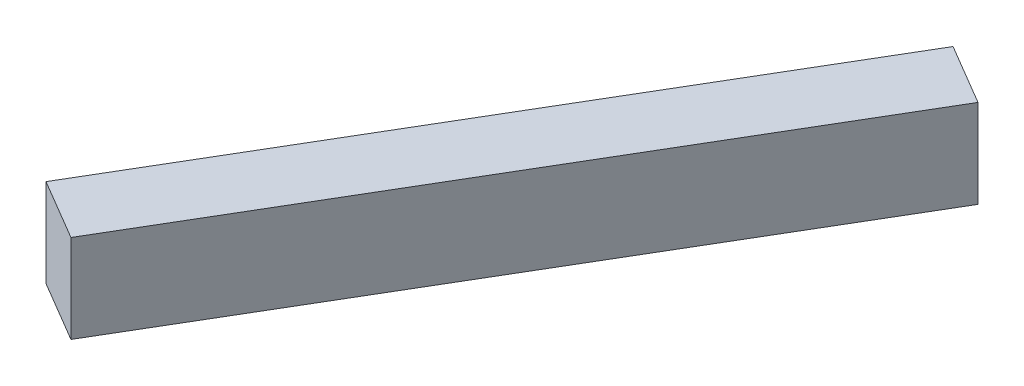
ISO-10303-21;
HEADER;
FILE_DESCRIPTION(('STEP AP214'),'2;1');
FILE_NAME('part.step','',(''),(''),'','','');
FILE_SCHEMA(('AUTOMOTIVE_DESIGN { 1 0 10303 214 1 1 1 1 }'));
ENDSEC;
DATA;
#1=APPLICATION_CONTEXT('core data for automotive mechanical design processes');
#2=APPLICATION_PROTOCOL_DEFINITION('international standard','automotive_design',2000,#1);
#3=PRODUCT_CONTEXT('',#1,'mechanical');
#4=PRODUCT('Part','Part','',(#3));
#5=PRODUCT_RELATED_PRODUCT_CATEGORY('part','',(#4));
#6=PRODUCT_DEFINITION_FORMATION('','',#4);
#7=PRODUCT_DEFINITION_CONTEXT('part definition',#1,'design');
#8=PRODUCT_DEFINITION('design','',#6,#7);
#9=PRODUCT_DEFINITION_SHAPE('','',#8);
#10=(LENGTH_UNIT() NAMED_UNIT(*) SI_UNIT(.MILLI.,.METRE.));
#11=(NAMED_UNIT(*) PLANE_ANGLE_UNIT() SI_UNIT($,.RADIAN.));
#12=(NAMED_UNIT(*) SI_UNIT($,.STERADIAN.) SOLID_ANGLE_UNIT());
#13=UNCERTAINTY_MEASURE_WITH_UNIT(LENGTH_MEASURE(1.E-05),#10,'distance_accuracy_value','');
#14=(GEOMETRIC_REPRESENTATION_CONTEXT(3) GLOBAL_UNCERTAINTY_ASSIGNED_CONTEXT((#13)) GLOBAL_UNIT_ASSIGNED_CONTEXT((#10,
#11,#12)) REPRESENTATION_CONTEXT('',''));
#15=CARTESIAN_POINT('',(0.,0.,0.));
#16=DIRECTION('',(0.,0.,1.));
#17=DIRECTION('',(1.,0.,0.));
#18=AXIS2_PLACEMENT_3D('',#15,#16,#17);
#19=CARTESIAN_POINT('',(9.05780376443169,7.874,-15.5523080797249));
#20=DIRECTION('',(0.861316006342608,0.,0.508069618475677));
#21=DIRECTION('',(0.508069618475677,0.,-0.861316006342608));
#22=AXIS2_PLACEMENT_3D('',#19,#20,#21);
#23=PLANE('',#22);
#24=DIRECTION('',(0.,1.,0.));
#25=VECTOR('',#24,1.);
#26=CARTESIAN_POINT('',(9.05780376443169,7.874,-15.5523080797249));
#27=LINE('',#26,#25);
#28=CARTESIAN_POINT('',(9.05780376443169,7.62,-15.5523080797249));
#29=VERTEX_POINT('',#28);
#30=CARTESIAN_POINT('',(9.05780376443169,7.874,-15.5523080797249));
#31=VERTEX_POINT('',#30);
#32=EDGE_CURVE('E20',#29,#31,#27,.T.);
#33=ORIENTED_EDGE('',*,*,#32,.T.);
#34=DIRECTION('',(0.508069618475711,0.,-0.861316006342588));
#35=VECTOR('',#34,1.);
#36=CARTESIAN_POINT('',(9.05780376443169,7.874,-15.5523080797249));
#37=LINE('',#36,#35);
#38=CARTESIAN_POINT('',(10.0256763876279,7.874,-17.1931150718075));
#39=VERTEX_POINT('',#38);
#40=EDGE_CURVE('E55',#31,#39,#37,.T.);
#41=ORIENTED_EDGE('',*,*,#40,.T.);
#42=DIRECTION('',(0.,1.,0.));
#43=VECTOR('',#42,1.);
#44=CARTESIAN_POINT('',(10.0256763876279,7.874,-17.1931150718075));
#45=LINE('',#44,#43);
#46=CARTESIAN_POINT('',(10.0256763876279,7.62,-17.1931150718075));
#47=VERTEX_POINT('',#46);
#48=EDGE_CURVE('E76',#39,#47,#45,.F.);
#49=ORIENTED_EDGE('',*,*,#48,.T.);
#50=DIRECTION('',(0.508069618475711,0.,-0.861316006342588));
#51=VECTOR('',#50,1.);
#52=CARTESIAN_POINT('',(9.05780376443169,7.62,-15.5523080797249));
#53=LINE('',#52,#51);
#54=EDGE_CURVE('E58',#29,#47,#53,.T.);
#55=ORIENTED_EDGE('',*,*,#54,.F.);
#56=EDGE_LOOP('',(#33,#41,#49,#55));
#57=FACE_BOUND('',#56,.T.);
#58=ADVANCED_FACE('F17',(#57),#23,.F.);
#59=CARTESIAN_POINT('',(9.05780376443169,7.874,-15.5523080797249));
#60=DIRECTION('',(0.508069618475639,0.,-0.861316006342631));
#61=DIRECTION('',(-0.861316006342631,0.,-0.508069618475639));
#62=AXIS2_PLACEMENT_3D('',#59,#60,#61);
#63=PLANE('',#62);
#64=DIRECTION('',(0.,1.,0.));
#65=VECTOR('',#64,1.);
#66=CARTESIAN_POINT('',(9.23282317692052,7.874,-15.4490683332506));
#67=LINE('',#66,#65);
#68=CARTESIAN_POINT('',(9.23282317692053,7.62,-15.4490683332506));
#69=VERTEX_POINT('',#68);
#70=CARTESIAN_POINT('',(9.23282317692053,7.874,-15.4490683332506));
#71=VERTEX_POINT('',#70);
#72=EDGE_CURVE('E73',#69,#71,#67,.T.);
#73=ORIENTED_EDGE('',*,*,#72,.T.);
#74=DIRECTION('',(-0.861316006342529,0.,-0.508069618475811));
#75=VECTOR('',#74,1.);
#76=CARTESIAN_POINT('',(9.23282317692052,7.874,-15.4490683332506));
#77=LINE('',#76,#75);
#78=EDGE_CURVE('E63',#71,#31,#77,.T.);
#79=ORIENTED_EDGE('',*,*,#78,.T.);
#80=ORIENTED_EDGE('',*,*,#32,.F.);
#81=DIRECTION('',(-0.861316006342529,0.,-0.508069618475811));
#82=VECTOR('',#81,1.);
#83=CARTESIAN_POINT('',(9.23282317692052,7.62,-15.4490683332506));
#84=LINE('',#83,#82);
#85=EDGE_CURVE('E80',#69,#29,#84,.T.);
#86=ORIENTED_EDGE('',*,*,#85,.F.);
#87=EDGE_LOOP('',(#73,#79,#80,#86));
#88=FACE_BOUND('',#87,.T.);
#89=ADVANCED_FACE('F72',(#88),#63,.F.);
#90=CARTESIAN_POINT('',(9.05780376443169,7.874,-15.5523080797249));
#91=DIRECTION('',(0.,-1.,0.));
#92=DIRECTION('',(0.,0.,-1.));
#93=AXIS2_PLACEMENT_3D('',#90,#91,#92);
#94=PLANE('',#93);
#95=ORIENTED_EDGE('',*,*,#78,.F.);
#96=DIRECTION('',(-0.508069618475676,0.,0.861316006342609));
#97=VECTOR('',#96,1.);
#98=CARTESIAN_POINT('',(9.23282317692052,7.874,-15.4490683332506));
#99=LINE('',#98,#97);
#100=CARTESIAN_POINT('',(10.2006958002738,7.874,-17.0898753255997));
#101=VERTEX_POINT('',#100);
#102=EDGE_CURVE('E83',#71,#101,#99,.F.);
#103=ORIENTED_EDGE('',*,*,#102,.T.);
#104=DIRECTION('',(0.861316007116063,0.,0.508069617164461));
#105=VECTOR('',#104,1.);
#106=CARTESIAN_POINT('',(10.0256763876279,7.874,-17.1931150718075));
#107=LINE('',#106,#105);
#108=EDGE_CURVE('E69',#101,#39,#107,.F.);
#109=ORIENTED_EDGE('',*,*,#108,.T.);
#110=ORIENTED_EDGE('',*,*,#40,.F.);
#111=EDGE_LOOP('',(#95,#103,#109,#110));
#112=FACE_BOUND('',#111,.T.);
#113=ADVANCED_FACE('F66',(#112),#94,.F.);
#114=CARTESIAN_POINT('',(10.0256763876279,7.874,-17.1931150718075));
#115=DIRECTION('',(-0.508069617164461,0.,0.861316007116063));
#116=DIRECTION('',(0.861316007116063,0.,0.508069617164461));
#117=AXIS2_PLACEMENT_3D('',#114,#115,#116);
#118=PLANE('',#117);
#119=ORIENTED_EDGE('',*,*,#48,.F.);
#120=ORIENTED_EDGE('',*,*,#108,.F.);
#121=DIRECTION('',(0.,1.,0.));
#122=VECTOR('',#121,1.);
#123=CARTESIAN_POINT('',(10.2006958002738,7.874,-17.0898753255997));
#124=LINE('',#123,#122);
#125=CARTESIAN_POINT('',(10.2006958002738,7.62,-17.0898753255997));
#126=VERTEX_POINT('',#125);
#127=EDGE_CURVE('E26',#101,#126,#124,.F.);
#128=ORIENTED_EDGE('',*,*,#127,.T.);
#129=DIRECTION('',(0.861316007115993,0.,0.508069617164581));
#130=VECTOR('',#129,1.);
#131=CARTESIAN_POINT('',(10.0256763876279,7.62,-17.1931150718075));
#132=LINE('',#131,#130);
#133=EDGE_CURVE('E34',#47,#126,#132,.T.);
#134=ORIENTED_EDGE('',*,*,#133,.F.);
#135=EDGE_LOOP('',(#119,#120,#128,#134));
#136=FACE_BOUND('',#135,.T.);
#137=ADVANCED_FACE('F88',(#136),#118,.F.);
#138=CARTESIAN_POINT('',(9.05780376443169,7.62,-15.5523080797249));
#139=DIRECTION('',(0.,-1.,0.));
#140=DIRECTION('',(0.,0.,-1.));
#141=AXIS2_PLACEMENT_3D('',#138,#139,#140);
#142=PLANE('',#141);
#143=DIRECTION('',(-0.508069618475676,0.,0.861316006342609));
#144=VECTOR('',#143,1.);
#145=CARTESIAN_POINT('',(9.23282317692052,7.62,-15.4490683332506));
#146=LINE('',#145,#144);
#147=EDGE_CURVE('E11',#126,#69,#146,.T.);
#148=ORIENTED_EDGE('',*,*,#147,.T.);
#149=ORIENTED_EDGE('',*,*,#85,.T.);
#150=ORIENTED_EDGE('',*,*,#54,.T.);
#151=ORIENTED_EDGE('',*,*,#133,.T.);
#152=EDGE_LOOP('',(#148,#149,#150,#151));
#153=FACE_BOUND('',#152,.T.);
#154=ADVANCED_FACE('F91',(#153),#142,.T.);
#155=CARTESIAN_POINT('',(9.23282317692052,7.874,-15.4490683332506));
#156=DIRECTION('',(-0.861316006342609,0.,-0.508069618475676));
#157=DIRECTION('',(-0.508069618475676,0.,0.861316006342609));
#158=AXIS2_PLACEMENT_3D('',#155,#156,#157);
#159=PLANE('',#158);
#160=ORIENTED_EDGE('',*,*,#127,.F.);
#161=ORIENTED_EDGE('',*,*,#102,.F.);
#162=ORIENTED_EDGE('',*,*,#72,.F.);
#163=ORIENTED_EDGE('',*,*,#147,.F.);
#164=EDGE_LOOP('',(#160,#161,#162,#163));
#165=FACE_BOUND('',#164,.T.);
#166=ADVANCED_FACE('F90',(#165),#159,.F.);
#167=CLOSED_SHELL('',(#58,#89,#113,#137,#154,#166));
#168=MANIFOLD_SOLID_BREP('B1',#167);
#169=ADVANCED_BREP_SHAPE_REPRESENTATION('',(#18,#168),#14);
#170=SHAPE_DEFINITION_REPRESENTATION(#9,#169);
ENDSEC;
END-ISO-10303-21;
